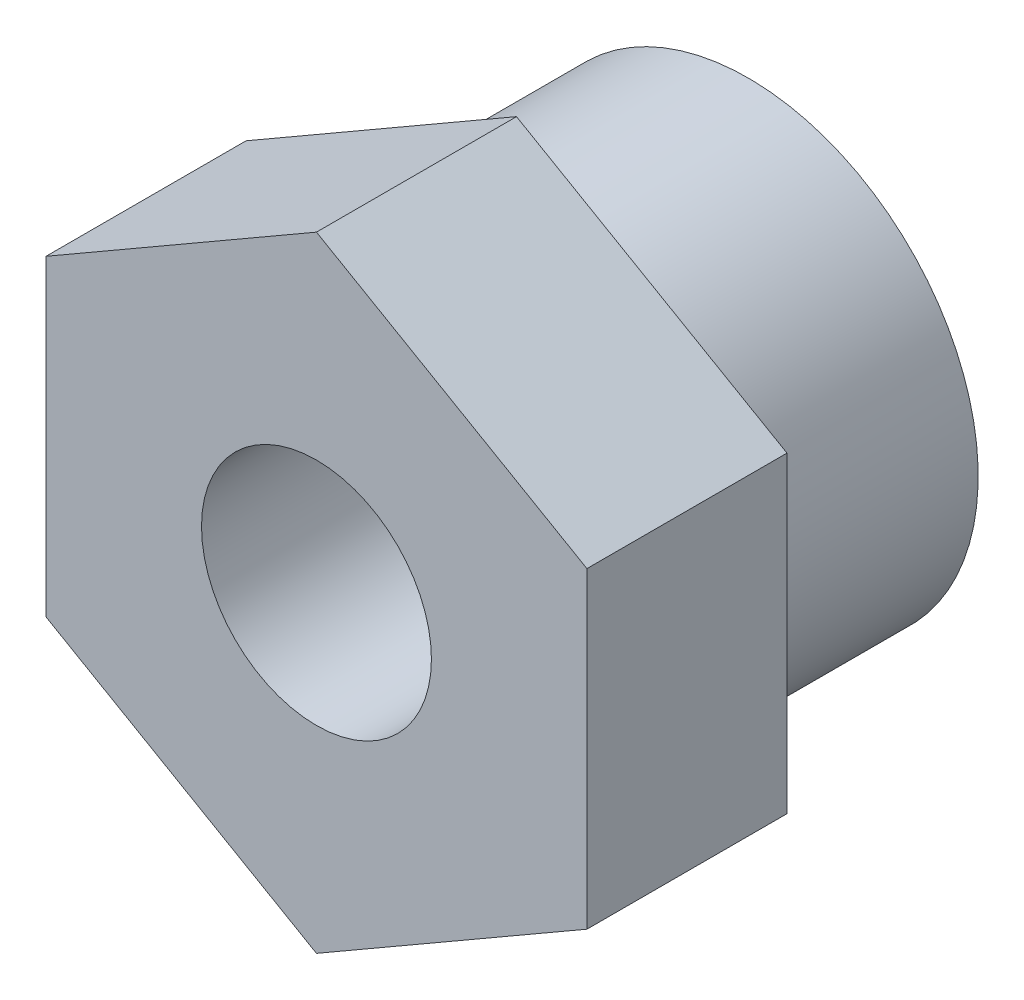
ISO-10303-21;
HEADER;
FILE_DESCRIPTION(('STEP AP214'),'2;1');
FILE_NAME('part.step','',(''),(''),'','','');
FILE_SCHEMA(('AUTOMOTIVE_DESIGN { 1 0 10303 214 1 1 1 1 }'));
ENDSEC;
DATA;
#1=APPLICATION_CONTEXT('core data for automotive mechanical design processes');
#2=APPLICATION_PROTOCOL_DEFINITION('international standard','automotive_design',2000,#1);
#3=PRODUCT_CONTEXT('',#1,'mechanical');
#4=PRODUCT('Part','Part','',(#3));
#5=PRODUCT_RELATED_PRODUCT_CATEGORY('part','',(#4));
#6=PRODUCT_DEFINITION_FORMATION('','',#4);
#7=PRODUCT_DEFINITION_CONTEXT('part definition',#1,'design');
#8=PRODUCT_DEFINITION('design','',#6,#7);
#9=PRODUCT_DEFINITION_SHAPE('','',#8);
#10=(LENGTH_UNIT() NAMED_UNIT(*) SI_UNIT(.MILLI.,.METRE.));
#11=(NAMED_UNIT(*) PLANE_ANGLE_UNIT() SI_UNIT($,.RADIAN.));
#12=(NAMED_UNIT(*) SI_UNIT($,.STERADIAN.) SOLID_ANGLE_UNIT());
#13=UNCERTAINTY_MEASURE_WITH_UNIT(LENGTH_MEASURE(1.E-05),#10,'distance_accuracy_value','');
#14=(GEOMETRIC_REPRESENTATION_CONTEXT(3) GLOBAL_UNCERTAINTY_ASSIGNED_CONTEXT((#13)) GLOBAL_UNIT_ASSIGNED_CONTEXT((#10,
#11,#12)) REPRESENTATION_CONTEXT('',''));
#15=CARTESIAN_POINT('',(0.,0.,0.));
#16=DIRECTION('',(0.,0.,1.));
#17=DIRECTION('',(1.,0.,0.));
#18=AXIS2_PLACEMENT_3D('',#15,#16,#17);
#19=CARTESIAN_POINT('',(0.,0.,0.));
#20=DIRECTION('',(0.,0.,1.));
#21=DIRECTION('',(1.,0.,0.));
#22=AXIS2_PLACEMENT_3D('',#19,#20,#21);
#23=PLANE('',#22);
#24=CARTESIAN_POINT('',(0.,0.,0.));
#25=DIRECTION('',(0.,0.,1.));
#26=DIRECTION('',(1.,0.,0.));
#27=AXIS2_PLACEMENT_3D('',#24,#25,#26);
#28=CIRCLE('',#27,6.35);
#29=CARTESIAN_POINT('',(6.35,0.,0.));
#30=VERTEX_POINT('',#29);
#31=EDGE_CURVE('E171',#30,#30,#28,.T.);
#32=ORIENTED_EDGE('',*,*,#31,.T.);
#33=EDGE_LOOP('',(#32));
#34=FACE_BOUND('',#33,.T.);
#35=CARTESIAN_POINT('',(0.,0.,0.));
#36=DIRECTION('',(0.,0.,-1.));
#37=DIRECTION('',(-1.,0.,0.));
#38=AXIS2_PLACEMENT_3D('',#35,#36,#37);
#39=CIRCLE('',#38,12.7);
#40=CARTESIAN_POINT('',(-12.7,0.,0.));
#41=VERTEX_POINT('',#40);
#42=EDGE_CURVE('E179',#41,#41,#39,.T.);
#43=ORIENTED_EDGE('',*,*,#42,.T.);
#44=EDGE_LOOP('',(#43));
#45=FACE_BOUND('',#44,.T.);
#46=ADVANCED_FACE('F62',(#34,#45),#23,.F.);
#47=CARTESIAN_POINT('',(0.,0.,23.85));
#48=DIRECTION('',(0.,0.,1.));
#49=DIRECTION('',(1.,0.,0.));
#50=AXIS2_PLACEMENT_3D('',#47,#48,#49);
#51=PLANE('',#50);
#52=CARTESIAN_POINT('',(0.,0.,23.85));
#53=DIRECTION('',(0.,0.,1.));
#54=DIRECTION('',(1.,0.,0.));
#55=AXIS2_PLACEMENT_3D('',#52,#53,#54);
#56=CIRCLE('',#55,6.34999999999999);
#57=CARTESIAN_POINT('',(6.34999999999999,0.,23.85));
#58=VERTEX_POINT('',#57);
#59=EDGE_CURVE('E175',#58,#58,#56,.T.);
#60=ORIENTED_EDGE('',*,*,#59,.F.);
#61=EDGE_LOOP('',(#60));
#62=FACE_BOUND('',#61,.T.);
#63=DIRECTION('',(0.,1.,0.));
#64=VECTOR('',#63,1.);
#65=CARTESIAN_POINT('',(14.9389382152816,1.56240718268664E-13,23.85));
#66=LINE('',#65,#64);
#67=CARTESIAN_POINT('',(14.9389382152817,-8.62499999999986,23.85));
#68=VERTEX_POINT('',#67);
#69=CARTESIAN_POINT('',(14.9389382152815,8.62500000000018,23.85));
#70=VERTEX_POINT('',#69);
#71=EDGE_CURVE('E147',#68,#70,#66,.T.);
#72=ORIENTED_EDGE('',*,*,#71,.T.);
#73=DIRECTION('',(-0.866025403784442,0.499999999999995,0.));
#74=VECTOR('',#73,1.);
#75=CARTESIAN_POINT('',(7.46946910764074,12.9375000000001,23.85));
#76=LINE('',#75,#74);
#77=CARTESIAN_POINT('',(0.,17.25,23.85));
#78=VERTEX_POINT('',#77);
#79=EDGE_CURVE('E169',#70,#78,#76,.T.);
#80=ORIENTED_EDGE('',*,*,#79,.T.);
#81=DIRECTION('',(-0.866025403784438,-0.500000000000001,0.));
#82=VECTOR('',#81,1.);
#83=CARTESIAN_POINT('',(-7.4694691076408,12.9375,23.85));
#84=LINE('',#83,#82);
#85=CARTESIAN_POINT('',(-14.9389382152816,8.62499999999996,23.85));
#86=VERTEX_POINT('',#85);
#87=EDGE_CURVE('E132',#78,#86,#84,.T.);
#88=ORIENTED_EDGE('',*,*,#87,.T.);
#89=DIRECTION('',(0.,-1.,0.));
#90=VECTOR('',#89,1.);
#91=CARTESIAN_POINT('',(-14.9389382152816,0.,23.85));
#92=LINE('',#91,#90);
#93=CARTESIAN_POINT('',(-14.9389382152815,-8.62500000000007,23.85));
#94=VERTEX_POINT('',#93);
#95=EDGE_CURVE('E86',#86,#94,#92,.T.);
#96=ORIENTED_EDGE('',*,*,#95,.T.);
#97=DIRECTION('',(0.866025403784442,-0.499999999999995,0.));
#98=VECTOR('',#97,1.);
#99=CARTESIAN_POINT('',(-7.46946910764071,-12.9375,23.85));
#100=LINE('',#99,#98);
#101=CARTESIAN_POINT('',(1.17961196366423E-13,-17.25,23.85));
#102=VERTEX_POINT('',#101);
#103=EDGE_CURVE('E141',#94,#102,#100,.T.);
#104=ORIENTED_EDGE('',*,*,#103,.T.);
#105=DIRECTION('',(0.866025403784435,0.500000000000007,0.));
#106=VECTOR('',#105,1.);
#107=CARTESIAN_POINT('',(7.46946910764088,-12.9374999999999,23.85));
#108=LINE('',#107,#106);
#109=EDGE_CURVE('E78',#102,#68,#108,.T.);
#110=ORIENTED_EDGE('',*,*,#109,.T.);
#111=EDGE_LOOP('',(#72,#80,#88,#96,#104,#110));
#112=FACE_BOUND('',#111,.T.);
#113=ADVANCED_FACE('F154',(#62,#112),#51,.T.);
#114=CARTESIAN_POINT('',(14.9389382152816,1.56240718268664E-13,12.8));
#115=DIRECTION('',(1.,0.,0.));
#116=DIRECTION('',(0.,1.,0.));
#117=AXIS2_PLACEMENT_3D('',#114,#115,#116);
#118=PLANE('',#117);
#119=ORIENTED_EDGE('',*,*,#71,.F.);
#120=DIRECTION('',(0.,0.,1.));
#121=VECTOR('',#120,1.);
#122=CARTESIAN_POINT('',(14.9389382152817,-8.62499999999986,12.8));
#123=LINE('',#122,#121);
#124=CARTESIAN_POINT('',(14.9389382152817,-8.62499999999986,12.8));
#125=VERTEX_POINT('',#124);
#126=EDGE_CURVE('E155',#125,#68,#123,.T.);
#127=ORIENTED_EDGE('',*,*,#126,.F.);
#128=DIRECTION('',(0.,1.,0.));
#129=VECTOR('',#128,1.);
#130=CARTESIAN_POINT('',(14.9389382152816,1.56240718268664E-13,12.8));
#131=LINE('',#130,#129);
#132=CARTESIAN_POINT('',(14.9389382152815,8.62500000000017,12.8));
#133=VERTEX_POINT('',#132);
#134=EDGE_CURVE('E145',#125,#133,#131,.T.);
#135=ORIENTED_EDGE('',*,*,#134,.T.);
#136=DIRECTION('',(0.,0.,1.));
#137=VECTOR('',#136,1.);
#138=CARTESIAN_POINT('',(14.9389382152815,8.62500000000018,12.8));
#139=LINE('',#138,#137);
#140=EDGE_CURVE('E65',#133,#70,#139,.T.);
#141=ORIENTED_EDGE('',*,*,#140,.T.);
#142=EDGE_LOOP('',(#119,#127,#135,#141));
#143=FACE_BOUND('',#142,.T.);
#144=ADVANCED_FACE('F163',(#143),#118,.T.);
#145=CARTESIAN_POINT('',(-7.46946910764071,-12.9375,12.8));
#146=DIRECTION('',(-0.499999999999995,-0.866025403784441,0.));
#147=DIRECTION('',(0.866025403784442,-0.499999999999995,0.));
#148=AXIS2_PLACEMENT_3D('',#145,#146,#147);
#149=PLANE('',#148);
#150=ORIENTED_EDGE('',*,*,#103,.F.);
#151=DIRECTION('',(0.,0.,1.));
#152=VECTOR('',#151,1.);
#153=CARTESIAN_POINT('',(-14.9389382152815,-8.62500000000007,12.8));
#154=LINE('',#153,#152);
#155=CARTESIAN_POINT('',(-14.9389382152815,-8.62500000000007,12.8));
#156=VERTEX_POINT('',#155);
#157=EDGE_CURVE('E124',#156,#94,#154,.T.);
#158=ORIENTED_EDGE('',*,*,#157,.F.);
#159=DIRECTION('',(0.866025403784442,-0.499999999999995,0.));
#160=VECTOR('',#159,1.);
#161=CARTESIAN_POINT('',(-7.46946910764071,-12.9375,12.8));
#162=LINE('',#161,#160);
#163=CARTESIAN_POINT('',(1.15359111152458E-13,-17.25,12.8));
#164=VERTEX_POINT('',#163);
#165=EDGE_CURVE('E122',#156,#164,#162,.T.);
#166=ORIENTED_EDGE('',*,*,#165,.T.);
#167=DIRECTION('',(0.,0.,1.));
#168=VECTOR('',#167,1.);
#169=CARTESIAN_POINT('',(1.17961196366423E-13,-17.25,12.8));
#170=LINE('',#169,#168);
#171=EDGE_CURVE('E135',#164,#102,#170,.T.);
#172=ORIENTED_EDGE('',*,*,#171,.T.);
#173=EDGE_LOOP('',(#150,#158,#166,#172));
#174=FACE_BOUND('',#173,.T.);
#175=ADVANCED_FACE('F156',(#174),#149,.T.);
#176=CARTESIAN_POINT('',(-7.4694691076408,12.9375,12.8));
#177=DIRECTION('',(-0.500000000000001,0.866025403784438,0.));
#178=DIRECTION('',(-0.866025403784438,-0.500000000000001,0.));
#179=AXIS2_PLACEMENT_3D('',#176,#177,#178);
#180=PLANE('',#179);
#181=ORIENTED_EDGE('',*,*,#87,.F.);
#182=DIRECTION('',(0.,0.,1.));
#183=VECTOR('',#182,1.);
#184=CARTESIAN_POINT('',(0.,17.25,12.8));
#185=LINE('',#184,#183);
#186=CARTESIAN_POINT('',(0.,17.25,12.8));
#187=VERTEX_POINT('',#186);
#188=EDGE_CURVE('E70',#187,#78,#185,.T.);
#189=ORIENTED_EDGE('',*,*,#188,.F.);
#190=DIRECTION('',(-0.866025403784438,-0.500000000000001,0.));
#191=VECTOR('',#190,1.);
#192=CARTESIAN_POINT('',(-7.4694691076408,12.9375,12.8));
#193=LINE('',#192,#191);
#194=CARTESIAN_POINT('',(-14.9389382152816,8.62499999999997,12.8));
#195=VERTEX_POINT('',#194);
#196=EDGE_CURVE('E119',#187,#195,#193,.T.);
#197=ORIENTED_EDGE('',*,*,#196,.T.);
#198=DIRECTION('',(0.,0.,1.));
#199=VECTOR('',#198,1.);
#200=CARTESIAN_POINT('',(-14.9389382152816,8.62499999999996,12.8));
#201=LINE('',#200,#199);
#202=EDGE_CURVE('E12',#195,#86,#201,.T.);
#203=ORIENTED_EDGE('',*,*,#202,.T.);
#204=EDGE_LOOP('',(#181,#189,#197,#203));
#205=FACE_BOUND('',#204,.T.);
#206=ADVANCED_FACE('F131',(#205),#180,.T.);
#207=CARTESIAN_POINT('',(-14.9389382152816,0.,12.8));
#208=DIRECTION('',(-1.,0.,0.));
#209=DIRECTION('',(0.,-1.,0.));
#210=AXIS2_PLACEMENT_3D('',#207,#208,#209);
#211=PLANE('',#210);
#212=ORIENTED_EDGE('',*,*,#95,.F.);
#213=ORIENTED_EDGE('',*,*,#202,.F.);
#214=DIRECTION('',(0.,-1.,0.));
#215=VECTOR('',#214,1.);
#216=CARTESIAN_POINT('',(-14.9389382152816,0.,12.8));
#217=LINE('',#216,#215);
#218=EDGE_CURVE('E116',#195,#156,#217,.T.);
#219=ORIENTED_EDGE('',*,*,#218,.T.);
#220=ORIENTED_EDGE('',*,*,#157,.T.);
#221=EDGE_LOOP('',(#212,#213,#219,#220));
#222=FACE_BOUND('',#221,.T.);
#223=ADVANCED_FACE('F126',(#222),#211,.T.);
#224=CARTESIAN_POINT('',(7.46946910764088,-12.9374999999999,12.8));
#225=DIRECTION('',(0.500000000000007,-0.866025403784435,0.));
#226=DIRECTION('',(0.866025403784435,0.500000000000007,0.));
#227=AXIS2_PLACEMENT_3D('',#224,#225,#226);
#228=PLANE('',#227);
#229=ORIENTED_EDGE('',*,*,#109,.F.);
#230=ORIENTED_EDGE('',*,*,#171,.F.);
#231=DIRECTION('',(0.866025403784435,0.500000000000007,0.));
#232=VECTOR('',#231,1.);
#233=CARTESIAN_POINT('',(7.46946910764088,-12.9374999999999,12.8));
#234=LINE('',#233,#232);
#235=EDGE_CURVE('E159',#164,#125,#234,.T.);
#236=ORIENTED_EDGE('',*,*,#235,.T.);
#237=ORIENTED_EDGE('',*,*,#126,.T.);
#238=EDGE_LOOP('',(#229,#230,#236,#237));
#239=FACE_BOUND('',#238,.T.);
#240=ADVANCED_FACE('F158',(#239),#228,.T.);
#241=CARTESIAN_POINT('',(7.46946910764074,12.9375000000001,12.8));
#242=DIRECTION('',(0.499999999999995,0.866025403784441,0.));
#243=DIRECTION('',(-0.866025403784441,0.499999999999995,0.));
#244=AXIS2_PLACEMENT_3D('',#241,#242,#243);
#245=PLANE('',#244);
#246=ORIENTED_EDGE('',*,*,#79,.F.);
#247=ORIENTED_EDGE('',*,*,#140,.F.);
#248=DIRECTION('',(-0.866025403784442,0.499999999999995,0.));
#249=VECTOR('',#248,1.);
#250=CARTESIAN_POINT('',(7.46946910764074,12.9375000000001,12.8));
#251=LINE('',#250,#249);
#252=EDGE_CURVE('E167',#133,#187,#251,.T.);
#253=ORIENTED_EDGE('',*,*,#252,.T.);
#254=ORIENTED_EDGE('',*,*,#188,.T.);
#255=EDGE_LOOP('',(#246,#247,#253,#254));
#256=FACE_BOUND('',#255,.T.);
#257=ADVANCED_FACE('F207',(#256),#245,.T.);
#258=CARTESIAN_POINT('',(0.,0.,23.85));
#259=DIRECTION('',(0.,0.,1.));
#260=DIRECTION('',(1.,0.,0.));
#261=AXIS2_PLACEMENT_3D('',#258,#259,#260);
#262=CYLINDRICAL_SURFACE('',#261,6.34999999999999);
#263=ORIENTED_EDGE('',*,*,#31,.F.);
#264=EDGE_LOOP('',(#263));
#265=FACE_BOUND('',#264,.T.);
#266=ORIENTED_EDGE('',*,*,#59,.T.);
#267=EDGE_LOOP('',(#266));
#268=FACE_BOUND('',#267,.T.);
#269=ADVANCED_FACE('F193',(#265,#268),#262,.F.);
#270=CARTESIAN_POINT('',(0.,0.,12.8));
#271=DIRECTION('',(0.,0.,-1.));
#272=DIRECTION('',(-1.,0.,0.));
#273=AXIS2_PLACEMENT_3D('',#270,#271,#272);
#274=CYLINDRICAL_SURFACE('',#273,12.7);
#275=CARTESIAN_POINT('',(0.,0.,12.8));
#276=DIRECTION('',(0.,0.,-1.));
#277=DIRECTION('',(-1.,0.,0.));
#278=AXIS2_PLACEMENT_3D('',#275,#276,#277);
#279=CIRCLE('',#278,12.7);
#280=CARTESIAN_POINT('',(-12.7,0.,12.8));
#281=VERTEX_POINT('',#280);
#282=EDGE_CURVE('E178',#281,#281,#279,.T.);
#283=ORIENTED_EDGE('',*,*,#282,.T.);
#284=EDGE_LOOP('',(#283));
#285=FACE_BOUND('',#284,.T.);
#286=ORIENTED_EDGE('',*,*,#42,.F.);
#287=EDGE_LOOP('',(#286));
#288=FACE_BOUND('',#287,.T.);
#289=ADVANCED_FACE('F185',(#285,#288),#274,.T.);
#290=CARTESIAN_POINT('',(0.,0.,12.8));
#291=DIRECTION('',(0.,0.,-1.));
#292=DIRECTION('',(-1.,0.,0.));
#293=AXIS2_PLACEMENT_3D('',#290,#291,#292);
#294=PLANE('',#293);
#295=ORIENTED_EDGE('',*,*,#282,.F.);
#296=EDGE_LOOP('',(#295));
#297=FACE_BOUND('',#296,.T.);
#298=ORIENTED_EDGE('',*,*,#218,.F.);
#299=ORIENTED_EDGE('',*,*,#196,.F.);
#300=ORIENTED_EDGE('',*,*,#252,.F.);
#301=ORIENTED_EDGE('',*,*,#134,.F.);
#302=ORIENTED_EDGE('',*,*,#235,.F.);
#303=ORIENTED_EDGE('',*,*,#165,.F.);
#304=EDGE_LOOP('',(#298,#299,#300,#301,#302,#303));
#305=FACE_BOUND('',#304,.T.);
#306=ADVANCED_FACE('F117',(#297,#305),#294,.T.);
#307=CLOSED_SHELL('',(#46,#113,#144,#175,#206,#223,#240,#257,#269,#289,#306));
#308=MANIFOLD_SOLID_BREP('B2',#307);
#309=ADVANCED_BREP_SHAPE_REPRESENTATION('',(#18,#308),#14);
#310=SHAPE_DEFINITION_REPRESENTATION(#9,#309);
ENDSEC;
END-ISO-10303-21;
